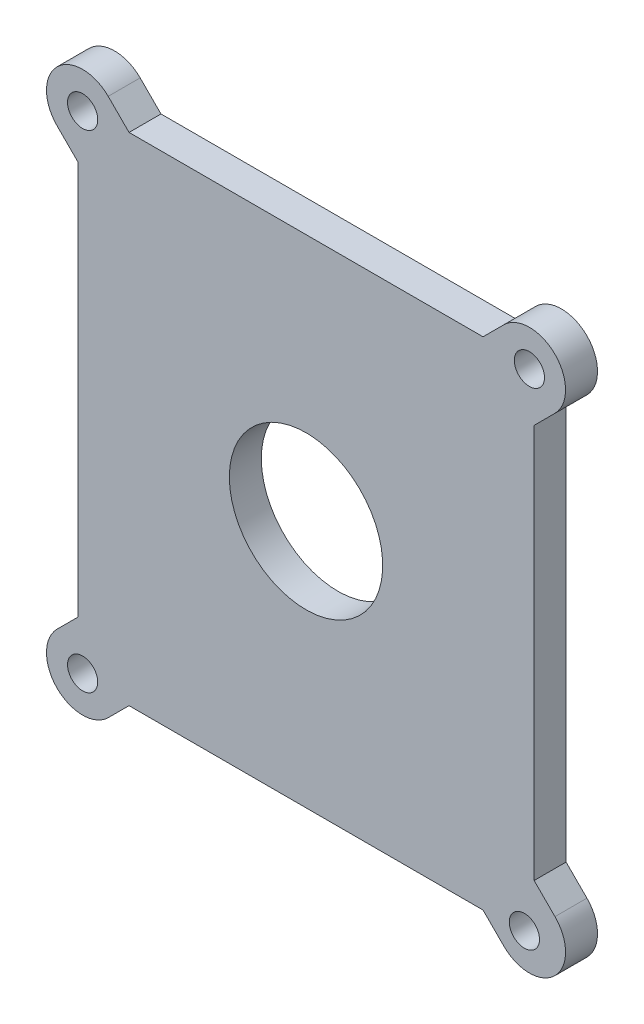
ISO-10303-21;
HEADER;
FILE_DESCRIPTION(('STEP AP214'),'2;1');
FILE_NAME('part.step','',(''),(''),'','','');
FILE_SCHEMA(('AUTOMOTIVE_DESIGN { 1 0 10303 214 1 1 1 1 }'));
ENDSEC;
DATA;
#1=APPLICATION_CONTEXT('core data for automotive mechanical design processes');
#2=APPLICATION_PROTOCOL_DEFINITION('international standard','automotive_design',2000,#1);
#3=PRODUCT_CONTEXT('',#1,'mechanical');
#4=PRODUCT('Part','Part','',(#3));
#5=PRODUCT_RELATED_PRODUCT_CATEGORY('part','',(#4));
#6=PRODUCT_DEFINITION_FORMATION('','',#4);
#7=PRODUCT_DEFINITION_CONTEXT('part definition',#1,'design');
#8=PRODUCT_DEFINITION('design','',#6,#7);
#9=PRODUCT_DEFINITION_SHAPE('','',#8);
#10=(LENGTH_UNIT() NAMED_UNIT(*) SI_UNIT(.MILLI.,.METRE.));
#11=(NAMED_UNIT(*) PLANE_ANGLE_UNIT() SI_UNIT($,.RADIAN.));
#12=(NAMED_UNIT(*) SI_UNIT($,.STERADIAN.) SOLID_ANGLE_UNIT());
#13=UNCERTAINTY_MEASURE_WITH_UNIT(LENGTH_MEASURE(1.E-05),#10,'distance_accuracy_value','');
#14=(GEOMETRIC_REPRESENTATION_CONTEXT(3) GLOBAL_UNCERTAINTY_ASSIGNED_CONTEXT((#13)) GLOBAL_UNIT_ASSIGNED_CONTEXT((#10,
#11,#12)) REPRESENTATION_CONTEXT('',''));
#15=CARTESIAN_POINT('',(0.,0.,0.));
#16=DIRECTION('',(0.,0.,1.));
#17=DIRECTION('',(1.,0.,0.));
#18=AXIS2_PLACEMENT_3D('',#15,#16,#17);
#19=CARTESIAN_POINT('',(-33.9979,0.,4.7625));
#20=DIRECTION('',(-1.,0.,0.));
#21=DIRECTION('',(0.,0.,1.));
#22=AXIS2_PLACEMENT_3D('',#19,#20,#21);
#23=PLANE('',#22);
#24=DIRECTION('',(0.,1.,0.));
#25=VECTOR('',#24,1.);
#26=CARTESIAN_POINT('',(-33.9979,0.,0.));
#27=LINE('',#26,#25);
#28=CARTESIAN_POINT('',(-33.9979,-29.3751,0.));
#29=VERTEX_POINT('',#28);
#30=CARTESIAN_POINT('',(-33.9979,29.3751,0.));
#31=VERTEX_POINT('',#30);
#32=EDGE_CURVE('E183',#29,#31,#27,.T.);
#33=ORIENTED_EDGE('',*,*,#32,.F.);
#34=DIRECTION('',(0.,0.,-1.));
#35=VECTOR('',#34,1.);
#36=CARTESIAN_POINT('',(-33.9979,-29.3751,4.7625));
#37=LINE('',#36,#35);
#38=CARTESIAN_POINT('',(-33.9979,-29.3751,4.7625));
#39=VERTEX_POINT('',#38);
#40=EDGE_CURVE('E170',#39,#29,#37,.T.);
#41=ORIENTED_EDGE('',*,*,#40,.F.);
#42=DIRECTION('',(0.,1.,0.));
#43=VECTOR('',#42,1.);
#44=CARTESIAN_POINT('',(-33.9979,0.,4.7625));
#45=LINE('',#44,#43);
#46=CARTESIAN_POINT('',(-33.9979,29.3751,4.7625));
#47=VERTEX_POINT('',#46);
#48=EDGE_CURVE('E181',#39,#47,#45,.T.);
#49=ORIENTED_EDGE('',*,*,#48,.T.);
#50=DIRECTION('',(0.,0.,-1.));
#51=VECTOR('',#50,1.);
#52=CARTESIAN_POINT('',(-33.9979,29.3751,4.7625));
#53=LINE('',#52,#51);
#54=EDGE_CURVE('E272',#47,#31,#53,.T.);
#55=ORIENTED_EDGE('',*,*,#54,.T.);
#56=EDGE_LOOP('',(#33,#41,#49,#55));
#57=FACE_BOUND('',#56,.T.);
#58=ADVANCED_FACE('F40',(#57),#23,.T.);
#59=CARTESIAN_POINT('',(0.,36.9951,4.7625));
#60=DIRECTION('',(0.,1.,0.));
#61=DIRECTION('',(0.,0.,1.));
#62=AXIS2_PLACEMENT_3D('',#59,#60,#61);
#63=PLANE('',#62);
#64=DIRECTION('',(1.,0.,0.));
#65=VECTOR('',#64,1.);
#66=CARTESIAN_POINT('',(0.,36.9951,0.));
#67=LINE('',#66,#65);
#68=CARTESIAN_POINT('',(-26.3779,36.9951,0.));
#69=VERTEX_POINT('',#68);
#70=CARTESIAN_POINT('',(26.3779,36.9951,0.));
#71=VERTEX_POINT('',#70);
#72=EDGE_CURVE('E211',#69,#71,#67,.T.);
#73=ORIENTED_EDGE('',*,*,#72,.F.);
#74=DIRECTION('',(0.,0.,-1.));
#75=VECTOR('',#74,1.);
#76=CARTESIAN_POINT('',(-26.3779,36.9951,4.7625));
#77=LINE('',#76,#75);
#78=CARTESIAN_POINT('',(-26.3779,36.9951,4.7625));
#79=VERTEX_POINT('',#78);
#80=EDGE_CURVE('E258',#79,#69,#77,.T.);
#81=ORIENTED_EDGE('',*,*,#80,.F.);
#82=DIRECTION('',(1.,0.,0.));
#83=VECTOR('',#82,1.);
#84=CARTESIAN_POINT('',(0.,36.9951,4.7625));
#85=LINE('',#84,#83);
#86=CARTESIAN_POINT('',(26.3779,36.9951,4.7625));
#87=VERTEX_POINT('',#86);
#88=EDGE_CURVE('E192',#79,#87,#85,.T.);
#89=ORIENTED_EDGE('',*,*,#88,.T.);
#90=DIRECTION('',(0.,0.,-1.));
#91=VECTOR('',#90,1.);
#92=CARTESIAN_POINT('',(26.3779,36.9951,4.7625));
#93=LINE('',#92,#91);
#94=EDGE_CURVE('E244',#87,#71,#93,.T.);
#95=ORIENTED_EDGE('',*,*,#94,.T.);
#96=EDGE_LOOP('',(#73,#81,#89,#95));
#97=FACE_BOUND('',#96,.T.);
#98=ADVANCED_FACE('F357',(#97),#63,.T.);
#99=CARTESIAN_POINT('',(33.9979,0.,4.7625));
#100=DIRECTION('',(1.,0.,0.));
#101=DIRECTION('',(0.,1.,0.));
#102=AXIS2_PLACEMENT_3D('',#99,#100,#101);
#103=PLANE('',#102);
#104=DIRECTION('',(0.,-1.,0.));
#105=VECTOR('',#104,1.);
#106=CARTESIAN_POINT('',(33.9979,0.,0.));
#107=LINE('',#106,#105);
#108=CARTESIAN_POINT('',(33.9979,29.3751,0.));
#109=VERTEX_POINT('',#108);
#110=CARTESIAN_POINT('',(33.9979,-29.3751,0.));
#111=VERTEX_POINT('',#110);
#112=EDGE_CURVE('E84',#109,#111,#107,.T.);
#113=ORIENTED_EDGE('',*,*,#112,.F.);
#114=DIRECTION('',(0.,0.,-1.));
#115=VECTOR('',#114,1.);
#116=CARTESIAN_POINT('',(33.9979,29.3751,4.7625));
#117=LINE('',#116,#115);
#118=CARTESIAN_POINT('',(33.9979,29.3751,4.7625));
#119=VERTEX_POINT('',#118);
#120=EDGE_CURVE('E202',#119,#109,#117,.T.);
#121=ORIENTED_EDGE('',*,*,#120,.F.);
#122=DIRECTION('',(0.,-1.,0.));
#123=VECTOR('',#122,1.);
#124=CARTESIAN_POINT('',(33.9979,0.,4.7625));
#125=LINE('',#124,#123);
#126=CARTESIAN_POINT('',(33.9979,-29.3751,4.7625));
#127=VERTEX_POINT('',#126);
#128=EDGE_CURVE('E57',#119,#127,#125,.T.);
#129=ORIENTED_EDGE('',*,*,#128,.T.);
#130=DIRECTION('',(0.,0.,-1.));
#131=VECTOR('',#130,1.);
#132=CARTESIAN_POINT('',(33.9979,-29.3751,4.7625));
#133=LINE('',#132,#131);
#134=EDGE_CURVE('E191',#127,#111,#133,.T.);
#135=ORIENTED_EDGE('',*,*,#134,.T.);
#136=EDGE_LOOP('',(#113,#121,#129,#135));
#137=FACE_BOUND('',#136,.T.);
#138=ADVANCED_FACE('F362',(#137),#103,.T.);
#139=CARTESIAN_POINT('',(0.,-36.9951,4.7625));
#140=DIRECTION('',(0.,1.,0.));
#141=DIRECTION('',(0.,0.,1.));
#142=AXIS2_PLACEMENT_3D('',#139,#140,#141);
#143=PLANE('',#142);
#144=DIRECTION('',(1.,0.,0.));
#145=VECTOR('',#144,1.);
#146=CARTESIAN_POINT('',(0.,-36.9951,4.7625));
#147=LINE('',#146,#145);
#148=CARTESIAN_POINT('',(-26.3779,-36.9951,4.7625));
#149=VERTEX_POINT('',#148);
#150=CARTESIAN_POINT('',(26.3779,-36.9951,4.7625));
#151=VERTEX_POINT('',#150);
#152=EDGE_CURVE('E91',#149,#151,#147,.T.);
#153=ORIENTED_EDGE('',*,*,#152,.F.);
#154=DIRECTION('',(0.,0.,-1.));
#155=VECTOR('',#154,1.);
#156=CARTESIAN_POINT('',(-26.3779,-36.9951,4.7625));
#157=LINE('',#156,#155);
#158=CARTESIAN_POINT('',(-26.3779,-36.9951,0.));
#159=VERTEX_POINT('',#158);
#160=EDGE_CURVE('E289',#149,#159,#157,.T.);
#161=ORIENTED_EDGE('',*,*,#160,.T.);
#162=DIRECTION('',(1.,0.,0.));
#163=VECTOR('',#162,1.);
#164=CARTESIAN_POINT('',(0.,-36.9951,0.));
#165=LINE('',#164,#163);
#166=CARTESIAN_POINT('',(26.3779,-36.9951,0.));
#167=VERTEX_POINT('',#166);
#168=EDGE_CURVE('E201',#159,#167,#165,.T.);
#169=ORIENTED_EDGE('',*,*,#168,.T.);
#170=DIRECTION('',(0.,0.,-1.));
#171=VECTOR('',#170,1.);
#172=CARTESIAN_POINT('',(26.3779,-36.9951,4.7625));
#173=LINE('',#172,#171);
#174=EDGE_CURVE('E11',#151,#167,#173,.T.);
#175=ORIENTED_EDGE('',*,*,#174,.F.);
#176=EDGE_LOOP('',(#153,#161,#169,#175));
#177=FACE_BOUND('',#176,.T.);
#178=ADVANCED_FACE('F369',(#177),#143,.F.);
#179=CARTESIAN_POINT('',(-5.30860000000003,-5.30860000000004,4.7625));
#180=DIRECTION('',(0.707106781186547,0.707106781186548,0.));
#181=DIRECTION('',(-0.707106781186548,0.707106781186547,0.));
#182=AXIS2_PLACEMENT_3D('',#179,#180,#181);
#183=PLANE('',#182);
#184=DIRECTION('',(0.707106781186548,-0.707106781186547,0.));
#185=VECTOR('',#184,1.);
#186=CARTESIAN_POINT('',(-5.30860000000003,-5.30860000000004,0.));
#187=LINE('',#186,#185);
#188=CARTESIAN_POINT('',(29.4838743299566,-40.1010743299566,0.));
#189=VERTEX_POINT('',#188);
#190=EDGE_CURVE('E204',#167,#189,#187,.T.);
#191=ORIENTED_EDGE('',*,*,#190,.T.);
#192=DIRECTION('',(0.,0.,-1.));
#193=VECTOR('',#192,1.);
#194=CARTESIAN_POINT('',(29.4838743299566,-40.1010743299566,4.7625));
#195=LINE('',#194,#193);
#196=CARTESIAN_POINT('',(29.4838743299566,-40.1010743299566,4.7625));
#197=VERTEX_POINT('',#196);
#198=EDGE_CURVE('E49',#197,#189,#195,.T.);
#199=ORIENTED_EDGE('',*,*,#198,.F.);
#200=DIRECTION('',(0.707106781186548,-0.707106781186547,0.));
#201=VECTOR('',#200,1.);
#202=CARTESIAN_POINT('',(-5.30860000000003,-5.30860000000004,4.7625));
#203=LINE('',#202,#201);
#204=EDGE_CURVE('E231',#151,#197,#203,.T.);
#205=ORIENTED_EDGE('',*,*,#204,.F.);
#206=ORIENTED_EDGE('',*,*,#174,.T.);
#207=EDGE_LOOP('',(#191,#199,#205,#206));
#208=FACE_BOUND('',#207,.T.);
#209=ADVANCED_FACE('F374',(#208),#183,.F.);
#210=CARTESIAN_POINT('',(33.2938743299567,-36.2910743299567,4.7625));
#211=DIRECTION('',(0.,0.,-1.));
#212=DIRECTION('',(-1.,0.,0.));
#213=AXIS2_PLACEMENT_3D('',#210,#211,#212);
#214=CYLINDRICAL_SURFACE('',#213,5.38815367264139);
#215=CARTESIAN_POINT('',(33.2938743299567,-36.2910743299567,0.));
#216=DIRECTION('',(0.,0.,1.));
#217=DIRECTION('',(1.,0.,0.));
#218=AXIS2_PLACEMENT_3D('',#215,#216,#217);
#219=CIRCLE('',#218,5.38815367264139);
#220=CARTESIAN_POINT('',(37.1038743299566,-32.4810743299569,0.));
#221=VERTEX_POINT('',#220);
#222=EDGE_CURVE('E206',#189,#221,#219,.T.);
#223=ORIENTED_EDGE('',*,*,#222,.T.);
#224=DIRECTION('',(0.,0.,-1.));
#225=VECTOR('',#224,1.);
#226=CARTESIAN_POINT('',(37.1038743299566,-32.4810743299569,4.7625));
#227=LINE('',#226,#225);
#228=CARTESIAN_POINT('',(37.1038743299566,-32.4810743299569,4.7625));
#229=VERTEX_POINT('',#228);
#230=EDGE_CURVE('E76',#229,#221,#227,.T.);
#231=ORIENTED_EDGE('',*,*,#230,.F.);
#232=CARTESIAN_POINT('',(33.2938743299567,-36.2910743299567,4.7625));
#233=DIRECTION('',(0.,0.,1.));
#234=DIRECTION('',(1.,0.,0.));
#235=AXIS2_PLACEMENT_3D('',#232,#233,#234);
#236=CIRCLE('',#235,5.38815367264139);
#237=EDGE_CURVE('E221',#197,#229,#236,.T.);
#238=ORIENTED_EDGE('',*,*,#237,.F.);
#239=ORIENTED_EDGE('',*,*,#198,.T.);
#240=EDGE_LOOP('',(#223,#231,#238,#239));
#241=FACE_BOUND('',#240,.T.);
#242=ADVANCED_FACE('F220',(#241),#214,.T.);
#243=CARTESIAN_POINT('',(2.31140000000166,2.31140000000143,4.7625));
#244=DIRECTION('',(0.707106781186582,0.707106781186513,0.));
#245=DIRECTION('',(-0.707106781186513,0.707106781186582,0.));
#246=AXIS2_PLACEMENT_3D('',#243,#244,#245);
#247=PLANE('',#246);
#248=DIRECTION('',(0.707106781186513,-0.707106781186582,0.));
#249=VECTOR('',#248,1.);
#250=CARTESIAN_POINT('',(2.31140000000166,2.31140000000143,0.));
#251=LINE('',#250,#249);
#252=EDGE_CURVE('E208',#111,#221,#251,.T.);
#253=ORIENTED_EDGE('',*,*,#252,.F.);
#254=ORIENTED_EDGE('',*,*,#134,.F.);
#255=DIRECTION('',(0.707106781186513,-0.707106781186582,0.));
#256=VECTOR('',#255,1.);
#257=CARTESIAN_POINT('',(2.31140000000166,2.31140000000143,4.7625));
#258=LINE('',#257,#256);
#259=EDGE_CURVE('E229',#127,#229,#258,.T.);
#260=ORIENTED_EDGE('',*,*,#259,.T.);
#261=ORIENTED_EDGE('',*,*,#230,.T.);
#262=EDGE_LOOP('',(#253,#254,#260,#261));
#263=FACE_BOUND('',#262,.T.);
#264=ADVANCED_FACE('F227',(#263),#247,.T.);
#265=CARTESIAN_POINT('',(0.,0.,4.7625));
#266=DIRECTION('',(0.,0.,-1.));
#267=DIRECTION('',(-1.,0.,0.));
#268=AXIS2_PLACEMENT_3D('',#265,#266,#267);
#269=CYLINDRICAL_SURFACE('',#268,11.43);
#270=CARTESIAN_POINT('',(0.,0.,4.7625));
#271=DIRECTION('',(0.,0.,1.));
#272=DIRECTION('',(1.,0.,0.));
#273=AXIS2_PLACEMENT_3D('',#270,#271,#272);
#274=CIRCLE('',#273,11.43);
#275=CARTESIAN_POINT('',(-11.43,0.,4.7625));
#276=VERTEX_POINT('',#275);
#277=EDGE_CURVE('E213',#276,#276,#274,.T.);
#278=CARTESIAN_POINT('',(0.,0.,0.));
#279=DIRECTION('',(0.,0.,1.));
#280=DIRECTION('',(1.,0.,0.));
#281=AXIS2_PLACEMENT_3D('',#278,#279,#280);
#282=CIRCLE('',#281,11.43);
#283=CARTESIAN_POINT('',(-11.43,0.,0.));
#284=VERTEX_POINT('',#283);
#285=EDGE_CURVE('E198',#284,#284,#282,.T.);
#286=CARTESIAN_POINT('',(-11.43,0.,4.7625));
#287=CARTESIAN_POINT('',(-11.43,0.,4.712890625));
#288=CARTESIAN_POINT('',(-11.43,0.,4.66328125));
#289=CARTESIAN_POINT('',(-11.43,0.,4.5640625));
#290=CARTESIAN_POINT('',(-11.43,0.,4.514453125));
#291=CARTESIAN_POINT('',(-11.43,0.,4.415234375));
#292=CARTESIAN_POINT('',(-11.43,0.,4.365625));
#293=CARTESIAN_POINT('',(-11.43,0.,4.26640625));
#294=CARTESIAN_POINT('',(-11.43,0.,4.216796875));
#295=CARTESIAN_POINT('',(-11.43,0.,4.117578125));
#296=CARTESIAN_POINT('',(-11.43,0.,4.06796875));
#297=CARTESIAN_POINT('',(-11.43,0.,3.96875));
#298=CARTESIAN_POINT('',(-11.43,0.,3.919140625));
#299=CARTESIAN_POINT('',(-11.43,0.,3.819921875));
#300=CARTESIAN_POINT('',(-11.43,0.,3.7703125));
#301=CARTESIAN_POINT('',(-11.43,0.,3.67109375));
#302=CARTESIAN_POINT('',(-11.43,0.,3.621484375));
#303=CARTESIAN_POINT('',(-11.43,0.,3.522265625));
#304=CARTESIAN_POINT('',(-11.43,0.,3.47265625));
#305=CARTESIAN_POINT('',(-11.43,0.,3.3734375));
#306=CARTESIAN_POINT('',(-11.43,0.,3.323828125));
#307=CARTESIAN_POINT('',(-11.43,0.,3.224609375));
#308=CARTESIAN_POINT('',(-11.43,0.,3.175));
#309=CARTESIAN_POINT('',(-11.43,0.,3.07578125));
#310=CARTESIAN_POINT('',(-11.43,0.,3.026171875));
#311=CARTESIAN_POINT('',(-11.43,0.,2.926953125));
#312=CARTESIAN_POINT('',(-11.43,0.,2.87734375));
#313=CARTESIAN_POINT('',(-11.43,0.,2.778125));
#314=CARTESIAN_POINT('',(-11.43,0.,2.728515625));
#315=CARTESIAN_POINT('',(-11.43,0.,2.629296875));
#316=CARTESIAN_POINT('',(-11.43,0.,2.5796875));
#317=CARTESIAN_POINT('',(-11.43,0.,2.48046875));
#318=CARTESIAN_POINT('',(-11.43,0.,2.430859375));
#319=CARTESIAN_POINT('',(-11.43,0.,2.331640625));
#320=CARTESIAN_POINT('',(-11.43,0.,2.28203125));
#321=CARTESIAN_POINT('',(-11.43,0.,2.1828125));
#322=CARTESIAN_POINT('',(-11.43,0.,2.133203125));
#323=CARTESIAN_POINT('',(-11.43,0.,2.033984375));
#324=CARTESIAN_POINT('',(-11.43,0.,1.984375));
#325=CARTESIAN_POINT('',(-11.43,0.,1.88515625));
#326=CARTESIAN_POINT('',(-11.43,0.,1.835546875));
#327=CARTESIAN_POINT('',(-11.43,0.,1.736328125));
#328=CARTESIAN_POINT('',(-11.43,0.,1.68671875));
#329=CARTESIAN_POINT('',(-11.43,0.,1.5875));
#330=CARTESIAN_POINT('',(-11.43,0.,1.537890625));
#331=CARTESIAN_POINT('',(-11.43,0.,1.438671875));
#332=CARTESIAN_POINT('',(-11.43,0.,1.3890625));
#333=CARTESIAN_POINT('',(-11.43,0.,1.28984375));
#334=CARTESIAN_POINT('',(-11.43,0.,1.240234375));
#335=CARTESIAN_POINT('',(-11.43,0.,1.141015625));
#336=CARTESIAN_POINT('',(-11.43,0.,1.09140625));
#337=CARTESIAN_POINT('',(-11.43,0.,0.9921875));
#338=CARTESIAN_POINT('',(-11.43,0.,0.942578125));
#339=CARTESIAN_POINT('',(-11.43,0.,0.843359375));
#340=CARTESIAN_POINT('',(-11.43,0.,0.79375));
#341=CARTESIAN_POINT('',(-11.43,0.,0.69453125));
#342=CARTESIAN_POINT('',(-11.43,0.,0.644921875));
#343=CARTESIAN_POINT('',(-11.43,0.,0.545703125));
#344=CARTESIAN_POINT('',(-11.43,0.,0.49609375));
#345=CARTESIAN_POINT('',(-11.43,0.,0.396875));
#346=CARTESIAN_POINT('',(-11.43,0.,0.347265625));
#347=CARTESIAN_POINT('',(-11.43,0.,0.248046875));
#348=CARTESIAN_POINT('',(-11.43,0.,0.1984375));
#349=CARTESIAN_POINT('',(-11.43,0.,0.09921875));
#350=CARTESIAN_POINT('',(-11.43,0.,0.049609375));
#351=CARTESIAN_POINT('',(-11.43,0.,0.));
#352=B_SPLINE_CURVE_WITH_KNOTS('',3,(#286,#287,#288,#289,#290,#291,#292,#293,#294,#295,#296,
#297,#298,#299,#300,#301,#302,#303,#304,#305,#306,#307,#308,#309,#310,#311,#312,#313,#314,#315,
#316,#317,#318,#319,#320,#321,#322,#323,#324,#325,#326,#327,#328,#329,#330,#331,#332,#333,#334,
#335,#336,#337,#338,#339,#340,#341,#342,#343,#344,#345,#346,#347,#348,#349,#350,#351),
.UNSPECIFIED.,.F.,.F.,(4,2,2,2,2,2,2,2,2,2,2,2,2,2,2,2,2,2,2,2,2,2,2,2,2,2,2,2,2,2,2,2,4),(0.,
0.148828124999999,0.297656249999999,0.446484374999999,0.595312499999999,0.744140625,0.89296875,
1.041796875,1.190625,1.339453125,1.48828125,1.637109375,1.7859375,1.934765625,2.08359375,
2.232421875,2.38125,2.530078125,2.67890625,2.827734375,2.9765625,3.125390625,3.27421875,
3.423046875,3.571875,3.720703125,3.86953125,4.018359375,4.1671875,4.316015625,4.46484375,
4.613671875,4.7625),.UNSPECIFIED.);
#353=EDGE_CURVE('BSEAM42',#276,#284,#352,.T.);
#354=ORIENTED_EDGE('',*,*,#277,.T.);
#355=ORIENTED_EDGE('',*,*,#285,.F.);
#356=ORIENTED_EDGE('',*,*,#353,.T.);
#357=ORIENTED_EDGE('',*,*,#353,.F.);
#358=EDGE_LOOP('',(#354,#356,#355,#357));
#359=FACE_BOUND('',#358,.T.);
#360=ADVANCED_FACE('F42',(#359),#269,.F.);
#361=CARTESIAN_POINT('',(0.,0.,4.7625));
#362=DIRECTION('',(0.,0.,1.));
#363=DIRECTION('',(1.,0.,0.));
#364=AXIS2_PLACEMENT_3D('',#361,#362,#363);
#365=PLANE('',#364);
#366=CARTESIAN_POINT('',(-33.2938743299567,36.2910743299567,4.7625));
#367=DIRECTION('',(0.,0.,1.));
#368=DIRECTION('',(1.,0.,0.));
#369=AXIS2_PLACEMENT_3D('',#366,#367,#368);
#370=CIRCLE('',#369,2.24999999999999);
#371=CARTESIAN_POINT('',(-31.0438743299567,36.2910743299567,4.7625));
#372=VERTEX_POINT('',#371);
#373=EDGE_CURVE('E324',#372,#372,#370,.T.);
#374=ORIENTED_EDGE('',*,*,#373,.F.);
#375=EDGE_LOOP('',(#374));
#376=FACE_BOUND('',#375,.T.);
#377=CARTESIAN_POINT('',(33.2938743299567,36.2910743299567,4.7625));
#378=DIRECTION('',(0.,0.,1.));
#379=DIRECTION('',(1.,0.,0.));
#380=AXIS2_PLACEMENT_3D('',#377,#378,#379);
#381=CIRCLE('',#380,2.24999999999999);
#382=CARTESIAN_POINT('',(35.5438743299567,36.2910743299567,4.7625));
#383=VERTEX_POINT('',#382);
#384=EDGE_CURVE('E318',#383,#383,#381,.T.);
#385=ORIENTED_EDGE('',*,*,#384,.F.);
#386=EDGE_LOOP('',(#385));
#387=FACE_BOUND('',#386,.T.);
#388=CARTESIAN_POINT('',(32.5471646817301,-36.5866527319255,4.7625));
#389=DIRECTION('',(0.,0.,1.));
#390=DIRECTION('',(1.,0.,0.));
#391=AXIS2_PLACEMENT_3D('',#388,#389,#390);
#392=CIRCLE('',#391,2.24999999999999);
#393=CARTESIAN_POINT('',(34.7971646817301,-36.5866527319255,4.7625));
#394=VERTEX_POINT('',#393);
#395=EDGE_CURVE('E312',#394,#394,#392,.T.);
#396=ORIENTED_EDGE('',*,*,#395,.F.);
#397=EDGE_LOOP('',(#396));
#398=FACE_BOUND('',#397,.T.);
#399=CARTESIAN_POINT('',(-33.2938743299567,-36.2910743299567,4.7625));
#400=DIRECTION('',(0.,0.,1.));
#401=DIRECTION('',(1.,0.,0.));
#402=AXIS2_PLACEMENT_3D('',#399,#400,#401);
#403=CIRCLE('',#402,2.24999999999999);
#404=CARTESIAN_POINT('',(-31.0438743299567,-36.2910743299567,4.7625));
#405=VERTEX_POINT('',#404);
#406=EDGE_CURVE('E306',#405,#405,#403,.T.);
#407=ORIENTED_EDGE('',*,*,#406,.F.);
#408=EDGE_LOOP('',(#407));
#409=FACE_BOUND('',#408,.T.);
#410=DIRECTION('',(-0.707106781186548,-0.707106781186547,0.));
#411=VECTOR('',#410,1.);
#412=CARTESIAN_POINT('',(5.30860000000003,-5.30860000000004,4.7625));
#413=LINE('',#412,#411);
#414=CARTESIAN_POINT('',(-29.4838743299566,-40.1010743299566,4.7625));
#415=VERTEX_POINT('',#414);
#416=EDGE_CURVE('E292',#149,#415,#413,.T.);
#417=ORIENTED_EDGE('',*,*,#416,.F.);
#418=ORIENTED_EDGE('',*,*,#152,.T.);
#419=ORIENTED_EDGE('',*,*,#204,.T.);
#420=ORIENTED_EDGE('',*,*,#237,.T.);
#421=ORIENTED_EDGE('',*,*,#259,.F.);
#422=ORIENTED_EDGE('',*,*,#128,.F.);
#423=DIRECTION('',(0.707106781186513,0.707106781186582,0.));
#424=VECTOR('',#423,1.);
#425=CARTESIAN_POINT('',(2.31140000000166,-2.31140000000143,4.7625));
#426=LINE('',#425,#424);
#427=CARTESIAN_POINT('',(37.1038743299566,32.4810743299569,4.7625));
#428=VERTEX_POINT('',#427);
#429=EDGE_CURVE('E251',#119,#428,#426,.T.);
#430=ORIENTED_EDGE('',*,*,#429,.T.);
#431=CARTESIAN_POINT('',(33.2938743299567,36.2910743299567,4.7625));
#432=DIRECTION('',(0.,0.,-1.));
#433=DIRECTION('',(1.,0.,0.));
#434=AXIS2_PLACEMENT_3D('',#431,#432,#433);
#435=CIRCLE('',#434,5.38815367264139);
#436=CARTESIAN_POINT('',(29.4838743299566,40.1010743299566,4.7625));
#437=VERTEX_POINT('',#436);
#438=EDGE_CURVE('E261',#437,#428,#435,.T.);
#439=ORIENTED_EDGE('',*,*,#438,.F.);
#440=DIRECTION('',(0.707106781186548,0.707106781186547,0.));
#441=VECTOR('',#440,1.);
#442=CARTESIAN_POINT('',(-5.30860000000003,5.30860000000004,4.7625));
#443=LINE('',#442,#441);
#444=EDGE_CURVE('E247',#87,#437,#443,.T.);
#445=ORIENTED_EDGE('',*,*,#444,.F.);
#446=ORIENTED_EDGE('',*,*,#88,.F.);
#447=DIRECTION('',(-0.707106781186548,0.707106781186547,0.));
#448=VECTOR('',#447,1.);
#449=CARTESIAN_POINT('',(5.30860000000003,5.30860000000004,4.7625));
#450=LINE('',#449,#448);
#451=CARTESIAN_POINT('',(-29.4838743299566,40.1010743299566,4.7625));
#452=VERTEX_POINT('',#451);
#453=EDGE_CURVE('E277',#79,#452,#450,.T.);
#454=ORIENTED_EDGE('',*,*,#453,.T.);
#455=CARTESIAN_POINT('',(-33.2938743299567,36.2910743299567,4.7625));
#456=DIRECTION('',(0.,0.,1.));
#457=DIRECTION('',(-1.,0.,0.));
#458=AXIS2_PLACEMENT_3D('',#455,#456,#457);
#459=CIRCLE('',#458,5.38815367264139);
#460=CARTESIAN_POINT('',(-37.1038743299566,32.4810743299569,4.7625));
#461=VERTEX_POINT('',#460);
#462=EDGE_CURVE('E283',#452,#461,#459,.T.);
#463=ORIENTED_EDGE('',*,*,#462,.T.);
#464=DIRECTION('',(-0.707106781186513,0.707106781186582,0.));
#465=VECTOR('',#464,1.);
#466=CARTESIAN_POINT('',(-2.31140000000166,-2.31140000000143,4.7625));
#467=LINE('',#466,#465);
#468=EDGE_CURVE('E190',#47,#461,#467,.T.);
#469=ORIENTED_EDGE('',*,*,#468,.F.);
#470=ORIENTED_EDGE('',*,*,#48,.F.);
#471=DIRECTION('',(-0.707106781186513,-0.707106781186582,0.));
#472=VECTOR('',#471,1.);
#473=CARTESIAN_POINT('',(-2.31140000000166,2.31140000000143,4.7625));
#474=LINE('',#473,#472);
#475=CARTESIAN_POINT('',(-37.1038743299566,-32.4810743299569,4.7625));
#476=VERTEX_POINT('',#475);
#477=EDGE_CURVE('E166',#39,#476,#474,.T.);
#478=ORIENTED_EDGE('',*,*,#477,.T.);
#479=CARTESIAN_POINT('',(-33.2938743299567,-36.2910743299567,4.7625));
#480=DIRECTION('',(0.,0.,-1.));
#481=DIRECTION('',(-1.,0.,0.));
#482=AXIS2_PLACEMENT_3D('',#479,#480,#481);
#483=CIRCLE('',#482,5.38815367264139);
#484=EDGE_CURVE('E176',#415,#476,#483,.T.);
#485=ORIENTED_EDGE('',*,*,#484,.F.);
#486=EDGE_LOOP('',(#417,#418,#419,#420,#421,#422,#430,#439,#445,#446,#454,#463,#469,#470,#478,#485));
#487=FACE_BOUND('',#486,.T.);
#488=ORIENTED_EDGE('',*,*,#277,.F.);
#489=EDGE_LOOP('',(#488));
#490=FACE_BOUND('',#489,.T.);
#491=ADVANCED_FACE('F187',(#376,#387,#398,#409,#487,#490),#365,.T.);
#492=CARTESIAN_POINT('',(0.,0.,0.));
#493=DIRECTION('',(0.,0.,1.));
#494=DIRECTION('',(1.,0.,0.));
#495=AXIS2_PLACEMENT_3D('',#492,#493,#494);
#496=PLANE('',#495);
#497=CARTESIAN_POINT('',(-33.2938743299567,36.2910743299567,0.));
#498=DIRECTION('',(0.,0.,1.));
#499=DIRECTION('',(1.,0.,0.));
#500=AXIS2_PLACEMENT_3D('',#497,#498,#499);
#501=CIRCLE('',#500,2.25);
#502=CARTESIAN_POINT('',(-31.0438743299567,36.2910743299567,0.));
#503=VERTEX_POINT('',#502);
#504=EDGE_CURVE('E321',#503,#503,#501,.T.);
#505=ORIENTED_EDGE('',*,*,#504,.T.);
#506=EDGE_LOOP('',(#505));
#507=FACE_BOUND('',#506,.T.);
#508=CARTESIAN_POINT('',(33.2938743299567,36.2910743299567,0.));
#509=DIRECTION('',(0.,0.,1.));
#510=DIRECTION('',(1.,0.,0.));
#511=AXIS2_PLACEMENT_3D('',#508,#509,#510);
#512=CIRCLE('',#511,2.25);
#513=CARTESIAN_POINT('',(35.5438743299567,36.2910743299567,0.));
#514=VERTEX_POINT('',#513);
#515=EDGE_CURVE('E315',#514,#514,#512,.T.);
#516=ORIENTED_EDGE('',*,*,#515,.T.);
#517=EDGE_LOOP('',(#516));
#518=FACE_BOUND('',#517,.T.);
#519=CARTESIAN_POINT('',(32.5471646817301,-36.5866527319255,0.));
#520=DIRECTION('',(0.,0.,1.));
#521=DIRECTION('',(1.,0.,0.));
#522=AXIS2_PLACEMENT_3D('',#519,#520,#521);
#523=CIRCLE('',#522,2.25);
#524=CARTESIAN_POINT('',(34.7971646817301,-36.5866527319255,0.));
#525=VERTEX_POINT('',#524);
#526=EDGE_CURVE('E309',#525,#525,#523,.T.);
#527=ORIENTED_EDGE('',*,*,#526,.T.);
#528=EDGE_LOOP('',(#527));
#529=FACE_BOUND('',#528,.T.);
#530=CARTESIAN_POINT('',(-33.2938743299567,-36.2910743299567,0.));
#531=DIRECTION('',(0.,0.,1.));
#532=DIRECTION('',(1.,0.,0.));
#533=AXIS2_PLACEMENT_3D('',#530,#531,#532);
#534=CIRCLE('',#533,2.25);
#535=CARTESIAN_POINT('',(-31.0438743299567,-36.2910743299567,0.));
#536=VERTEX_POINT('',#535);
#537=EDGE_CURVE('E300',#536,#536,#534,.T.);
#538=ORIENTED_EDGE('',*,*,#537,.T.);
#539=EDGE_LOOP('',(#538));
#540=FACE_BOUND('',#539,.T.);
#541=ORIENTED_EDGE('',*,*,#168,.F.);
#542=DIRECTION('',(-0.707106781186548,-0.707106781186547,0.));
#543=VECTOR('',#542,1.);
#544=CARTESIAN_POINT('',(5.30860000000003,-5.30860000000004,0.));
#545=LINE('',#544,#543);
#546=CARTESIAN_POINT('',(-29.4838743299566,-40.1010743299566,0.));
#547=VERTEX_POINT('',#546);
#548=EDGE_CURVE('E177',#159,#547,#545,.T.);
#549=ORIENTED_EDGE('',*,*,#548,.T.);
#550=CARTESIAN_POINT('',(-33.2938743299567,-36.2910743299567,0.));
#551=DIRECTION('',(0.,0.,-1.));
#552=DIRECTION('',(-1.,0.,0.));
#553=AXIS2_PLACEMENT_3D('',#550,#551,#552);
#554=CIRCLE('',#553,5.38815367264139);
#555=CARTESIAN_POINT('',(-37.1038743299566,-32.4810743299569,0.));
#556=VERTEX_POINT('',#555);
#557=EDGE_CURVE('E295',#547,#556,#554,.T.);
#558=ORIENTED_EDGE('',*,*,#557,.T.);
#559=DIRECTION('',(-0.707106781186513,-0.707106781186582,0.));
#560=VECTOR('',#559,1.);
#561=CARTESIAN_POINT('',(-2.31140000000166,2.31140000000143,0.));
#562=LINE('',#561,#560);
#563=EDGE_CURVE('E298',#29,#556,#562,.T.);
#564=ORIENTED_EDGE('',*,*,#563,.F.);
#565=ORIENTED_EDGE('',*,*,#32,.T.);
#566=DIRECTION('',(-0.707106781186513,0.707106781186582,0.));
#567=VECTOR('',#566,1.);
#568=CARTESIAN_POINT('',(-2.31140000000166,-2.31140000000143,0.));
#569=LINE('',#568,#567);
#570=CARTESIAN_POINT('',(-37.1038743299566,32.4810743299569,0.));
#571=VERTEX_POINT('',#570);
#572=EDGE_CURVE('E274',#31,#571,#569,.T.);
#573=ORIENTED_EDGE('',*,*,#572,.T.);
#574=CARTESIAN_POINT('',(-33.2938743299567,36.2910743299567,0.));
#575=DIRECTION('',(0.,0.,1.));
#576=DIRECTION('',(-1.,0.,0.));
#577=AXIS2_PLACEMENT_3D('',#574,#575,#576);
#578=CIRCLE('',#577,5.38815367264139);
#579=CARTESIAN_POINT('',(-29.4838743299566,40.1010743299566,0.));
#580=VERTEX_POINT('',#579);
#581=EDGE_CURVE('E278',#580,#571,#578,.T.);
#582=ORIENTED_EDGE('',*,*,#581,.F.);
#583=DIRECTION('',(-0.707106781186548,0.707106781186547,0.));
#584=VECTOR('',#583,1.);
#585=CARTESIAN_POINT('',(5.30860000000003,5.30860000000004,0.));
#586=LINE('',#585,#584);
#587=EDGE_CURVE('E184',#69,#580,#586,.T.);
#588=ORIENTED_EDGE('',*,*,#587,.F.);
#589=ORIENTED_EDGE('',*,*,#72,.T.);
#590=DIRECTION('',(0.707106781186548,0.707106781186547,0.));
#591=VECTOR('',#590,1.);
#592=CARTESIAN_POINT('',(-5.30860000000003,5.30860000000004,0.));
#593=LINE('',#592,#591);
#594=CARTESIAN_POINT('',(29.4838743299566,40.1010743299566,0.));
#595=VERTEX_POINT('',#594);
#596=EDGE_CURVE('E248',#71,#595,#593,.T.);
#597=ORIENTED_EDGE('',*,*,#596,.T.);
#598=CARTESIAN_POINT('',(33.2938743299567,36.2910743299567,0.));
#599=DIRECTION('',(0.,0.,-1.));
#600=DIRECTION('',(1.,0.,0.));
#601=AXIS2_PLACEMENT_3D('',#598,#599,#600);
#602=CIRCLE('',#601,5.38815367264139);
#603=CARTESIAN_POINT('',(37.1038743299566,32.4810743299569,0.));
#604=VERTEX_POINT('',#603);
#605=EDGE_CURVE('E252',#595,#604,#602,.T.);
#606=ORIENTED_EDGE('',*,*,#605,.T.);
#607=DIRECTION('',(0.707106781186513,0.707106781186582,0.));
#608=VECTOR('',#607,1.);
#609=CARTESIAN_POINT('',(2.31140000000166,-2.31140000000143,0.));
#610=LINE('',#609,#608);
#611=EDGE_CURVE('E255',#109,#604,#610,.T.);
#612=ORIENTED_EDGE('',*,*,#611,.F.);
#613=ORIENTED_EDGE('',*,*,#112,.T.);
#614=ORIENTED_EDGE('',*,*,#252,.T.);
#615=ORIENTED_EDGE('',*,*,#222,.F.);
#616=ORIENTED_EDGE('',*,*,#190,.F.);
#617=EDGE_LOOP('',(#541,#549,#558,#564,#565,#573,#582,#588,#589,#597,#606,#612,#613,#614,#615,#616));
#618=FACE_BOUND('',#617,.T.);
#619=ORIENTED_EDGE('',*,*,#285,.T.);
#620=EDGE_LOOP('',(#619));
#621=FACE_BOUND('',#620,.T.);
#622=ADVANCED_FACE('F225',(#507,#518,#529,#540,#618,#621),#496,.F.);
#623=CARTESIAN_POINT('',(33.2938743299567,36.2910743299567,4.7625));
#624=DIRECTION('',(0.,0.,-1.));
#625=DIRECTION('',(-1.,0.,0.));
#626=AXIS2_PLACEMENT_3D('',#623,#624,#625);
#627=CYLINDRICAL_SURFACE('',#626,5.38815367264139);
#628=ORIENTED_EDGE('',*,*,#605,.F.);
#629=DIRECTION('',(0.,0.,-1.));
#630=VECTOR('',#629,1.);
#631=CARTESIAN_POINT('',(29.4838743299566,40.1010743299566,4.7625));
#632=LINE('',#631,#630);
#633=EDGE_CURVE('E242',#437,#595,#632,.T.);
#634=ORIENTED_EDGE('',*,*,#633,.F.);
#635=ORIENTED_EDGE('',*,*,#438,.T.);
#636=DIRECTION('',(0.,0.,-1.));
#637=VECTOR('',#636,1.);
#638=CARTESIAN_POINT('',(37.1038743299566,32.4810743299569,4.7625));
#639=LINE('',#638,#637);
#640=EDGE_CURVE('E240',#428,#604,#639,.T.);
#641=ORIENTED_EDGE('',*,*,#640,.T.);
#642=EDGE_LOOP('',(#628,#634,#635,#641));
#643=FACE_BOUND('',#642,.T.);
#644=ADVANCED_FACE('F406',(#643),#627,.T.);
#645=CARTESIAN_POINT('',(-5.30860000000003,5.30860000000004,4.7625));
#646=DIRECTION('',(-0.707106781186547,0.707106781186548,0.));
#647=DIRECTION('',(-0.707106781186548,-0.707106781186547,0.));
#648=AXIS2_PLACEMENT_3D('',#645,#646,#647);
#649=PLANE('',#648);
#650=ORIENTED_EDGE('',*,*,#596,.F.);
#651=ORIENTED_EDGE('',*,*,#94,.F.);
#652=ORIENTED_EDGE('',*,*,#444,.T.);
#653=ORIENTED_EDGE('',*,*,#633,.T.);
#654=EDGE_LOOP('',(#650,#651,#652,#653));
#655=FACE_BOUND('',#654,.T.);
#656=ADVANCED_FACE('F401',(#655),#649,.T.);
#657=CARTESIAN_POINT('',(2.31140000000166,-2.31140000000143,4.7625));
#658=DIRECTION('',(-0.707106781186582,0.707106781186513,0.));
#659=DIRECTION('',(-0.707106781186513,-0.707106781186582,0.));
#660=AXIS2_PLACEMENT_3D('',#657,#658,#659);
#661=PLANE('',#660);
#662=ORIENTED_EDGE('',*,*,#611,.T.);
#663=ORIENTED_EDGE('',*,*,#640,.F.);
#664=ORIENTED_EDGE('',*,*,#429,.F.);
#665=ORIENTED_EDGE('',*,*,#120,.T.);
#666=EDGE_LOOP('',(#662,#663,#664,#665));
#667=FACE_BOUND('',#666,.T.);
#668=ADVANCED_FACE('F408',(#667),#661,.F.);
#669=CARTESIAN_POINT('',(5.30860000000003,5.30860000000004,4.7625));
#670=DIRECTION('',(-0.707106781186547,-0.707106781186548,0.));
#671=DIRECTION('',(0.707106781186548,-0.707106781186547,0.));
#672=AXIS2_PLACEMENT_3D('',#669,#670,#671);
#673=PLANE('',#672);
#674=ORIENTED_EDGE('',*,*,#587,.T.);
#675=DIRECTION('',(0.,0.,-1.));
#676=VECTOR('',#675,1.);
#677=CARTESIAN_POINT('',(-29.4838743299566,40.1010743299566,4.7625));
#678=LINE('',#677,#676);
#679=EDGE_CURVE('E267',#452,#580,#678,.T.);
#680=ORIENTED_EDGE('',*,*,#679,.F.);
#681=ORIENTED_EDGE('',*,*,#453,.F.);
#682=ORIENTED_EDGE('',*,*,#80,.T.);
#683=EDGE_LOOP('',(#674,#680,#681,#682));
#684=FACE_BOUND('',#683,.T.);
#685=ADVANCED_FACE('F396',(#684),#673,.F.);
#686=CARTESIAN_POINT('',(-33.2938743299567,36.2910743299567,4.7625));
#687=DIRECTION('',(0.,0.,-1.));
#688=DIRECTION('',(-1.,0.,0.));
#689=AXIS2_PLACEMENT_3D('',#686,#687,#688);
#690=CYLINDRICAL_SURFACE('',#689,5.38815367264139);
#691=ORIENTED_EDGE('',*,*,#581,.T.);
#692=DIRECTION('',(0.,0.,-1.));
#693=VECTOR('',#692,1.);
#694=CARTESIAN_POINT('',(-37.1038743299566,32.4810743299569,4.7625));
#695=LINE('',#694,#693);
#696=EDGE_CURVE('E270',#461,#571,#695,.T.);
#697=ORIENTED_EDGE('',*,*,#696,.F.);
#698=ORIENTED_EDGE('',*,*,#462,.F.);
#699=ORIENTED_EDGE('',*,*,#679,.T.);
#700=EDGE_LOOP('',(#691,#697,#698,#699));
#701=FACE_BOUND('',#700,.T.);
#702=ADVANCED_FACE('F390',(#701),#690,.T.);
#703=CARTESIAN_POINT('',(-2.31140000000166,-2.31140000000143,4.7625));
#704=DIRECTION('',(-0.707106781186582,-0.707106781186513,0.));
#705=DIRECTION('',(0.707106781186513,-0.707106781186582,0.));
#706=AXIS2_PLACEMENT_3D('',#703,#704,#705);
#707=PLANE('',#706);
#708=ORIENTED_EDGE('',*,*,#572,.F.);
#709=ORIENTED_EDGE('',*,*,#54,.F.);
#710=ORIENTED_EDGE('',*,*,#468,.T.);
#711=ORIENTED_EDGE('',*,*,#696,.T.);
#712=EDGE_LOOP('',(#708,#709,#710,#711));
#713=FACE_BOUND('',#712,.T.);
#714=ADVANCED_FACE('F386',(#713),#707,.T.);
#715=CARTESIAN_POINT('',(-2.31140000000166,2.31140000000143,4.7625));
#716=DIRECTION('',(0.707106781186582,-0.707106781186513,0.));
#717=DIRECTION('',(0.707106781186513,0.707106781186582,0.));
#718=AXIS2_PLACEMENT_3D('',#715,#716,#717);
#719=PLANE('',#718);
#720=ORIENTED_EDGE('',*,*,#563,.T.);
#721=DIRECTION('',(0.,0.,-1.));
#722=VECTOR('',#721,1.);
#723=CARTESIAN_POINT('',(-37.1038743299566,-32.4810743299569,4.7625));
#724=LINE('',#723,#722);
#725=EDGE_CURVE('E172',#476,#556,#724,.T.);
#726=ORIENTED_EDGE('',*,*,#725,.F.);
#727=ORIENTED_EDGE('',*,*,#477,.F.);
#728=ORIENTED_EDGE('',*,*,#40,.T.);
#729=EDGE_LOOP('',(#720,#726,#727,#728));
#730=FACE_BOUND('',#729,.T.);
#731=ADVANCED_FACE('F169',(#730),#719,.F.);
#732=CARTESIAN_POINT('',(-33.2938743299567,-36.2910743299567,4.7625));
#733=DIRECTION('',(0.,0.,-1.));
#734=DIRECTION('',(-1.,0.,0.));
#735=AXIS2_PLACEMENT_3D('',#732,#733,#734);
#736=CYLINDRICAL_SURFACE('',#735,5.38815367264139);
#737=ORIENTED_EDGE('',*,*,#557,.F.);
#738=DIRECTION('',(0.,0.,-1.));
#739=VECTOR('',#738,1.);
#740=CARTESIAN_POINT('',(-29.4838743299566,-40.1010743299566,4.7625));
#741=LINE('',#740,#739);
#742=EDGE_CURVE('E287',#415,#547,#741,.T.);
#743=ORIENTED_EDGE('',*,*,#742,.F.);
#744=ORIENTED_EDGE('',*,*,#484,.T.);
#745=ORIENTED_EDGE('',*,*,#725,.T.);
#746=EDGE_LOOP('',(#737,#743,#744,#745));
#747=FACE_BOUND('',#746,.T.);
#748=ADVANCED_FACE('F352',(#747),#736,.T.);
#749=CARTESIAN_POINT('',(5.30860000000003,-5.30860000000004,4.7625));
#750=DIRECTION('',(0.707106781186547,-0.707106781186548,0.));
#751=DIRECTION('',(0.707106781186548,0.707106781186547,0.));
#752=AXIS2_PLACEMENT_3D('',#749,#750,#751);
#753=PLANE('',#752);
#754=ORIENTED_EDGE('',*,*,#548,.F.);
#755=ORIENTED_EDGE('',*,*,#160,.F.);
#756=ORIENTED_EDGE('',*,*,#416,.T.);
#757=ORIENTED_EDGE('',*,*,#742,.T.);
#758=EDGE_LOOP('',(#754,#755,#756,#757));
#759=FACE_BOUND('',#758,.T.);
#760=ADVANCED_FACE('F342',(#759),#753,.T.);
#761=CARTESIAN_POINT('',(-33.2938743299567,-36.2910743299567,4.7625));
#762=DIRECTION('',(0.,0.,1.));
#763=DIRECTION('',(1.,0.,0.));
#764=AXIS2_PLACEMENT_3D('',#761,#762,#763);
#765=CYLINDRICAL_SURFACE('',#764,2.24999999999999);
#766=ORIENTED_EDGE('',*,*,#537,.F.);
#767=EDGE_LOOP('',(#766));
#768=FACE_BOUND('',#767,.T.);
#769=ORIENTED_EDGE('',*,*,#406,.T.);
#770=EDGE_LOOP('',(#769));
#771=FACE_BOUND('',#770,.T.);
#772=ADVANCED_FACE('F339',(#768,#771),#765,.F.);
#773=CARTESIAN_POINT('',(32.5471646817301,-36.5866527319255,4.7625));
#774=DIRECTION('',(0.,0.,1.));
#775=DIRECTION('',(1.,0.,0.));
#776=AXIS2_PLACEMENT_3D('',#773,#774,#775);
#777=CYLINDRICAL_SURFACE('',#776,2.25);
#778=ORIENTED_EDGE('',*,*,#526,.F.);
#779=EDGE_LOOP('',(#778));
#780=FACE_BOUND('',#779,.T.);
#781=ORIENTED_EDGE('',*,*,#395,.T.);
#782=EDGE_LOOP('',(#781));
#783=FACE_BOUND('',#782,.T.);
#784=ADVANCED_FACE('F341',(#780,#783),#777,.F.);
#785=CARTESIAN_POINT('',(33.2938743299567,36.2910743299567,4.7625));
#786=DIRECTION('',(0.,0.,1.));
#787=DIRECTION('',(1.,0.,0.));
#788=AXIS2_PLACEMENT_3D('',#785,#786,#787);
#789=CYLINDRICAL_SURFACE('',#788,2.25);
#790=ORIENTED_EDGE('',*,*,#515,.F.);
#791=EDGE_LOOP('',(#790));
#792=FACE_BOUND('',#791,.T.);
#793=ORIENTED_EDGE('',*,*,#384,.T.);
#794=EDGE_LOOP('',(#793));
#795=FACE_BOUND('',#794,.T.);
#796=ADVANCED_FACE('F349',(#792,#795),#789,.F.);
#797=CARTESIAN_POINT('',(-33.2938743299567,36.2910743299567,4.7625));
#798=DIRECTION('',(0.,0.,1.));
#799=DIRECTION('',(1.,0.,0.));
#800=AXIS2_PLACEMENT_3D('',#797,#798,#799);
#801=CYLINDRICAL_SURFACE('',#800,2.24999999999999);
#802=ORIENTED_EDGE('',*,*,#504,.F.);
#803=EDGE_LOOP('',(#802));
#804=FACE_BOUND('',#803,.T.);
#805=ORIENTED_EDGE('',*,*,#373,.T.);
#806=EDGE_LOOP('',(#805));
#807=FACE_BOUND('',#806,.T.);
#808=ADVANCED_FACE('F328',(#804,#807),#801,.F.);
#809=CLOSED_SHELL('',(#58,#98,#138,#178,#209,#242,#264,#360,#491,#622,#644,#656,#668,#685,#702,
#714,#731,#748,#760,#772,#784,#796,#808));
#810=MANIFOLD_SOLID_BREP('B2',#809);
#811=ADVANCED_BREP_SHAPE_REPRESENTATION('',(#18,#810),#14);
#812=SHAPE_DEFINITION_REPRESENTATION(#9,#811);
ENDSEC;
END-ISO-10303-21;
